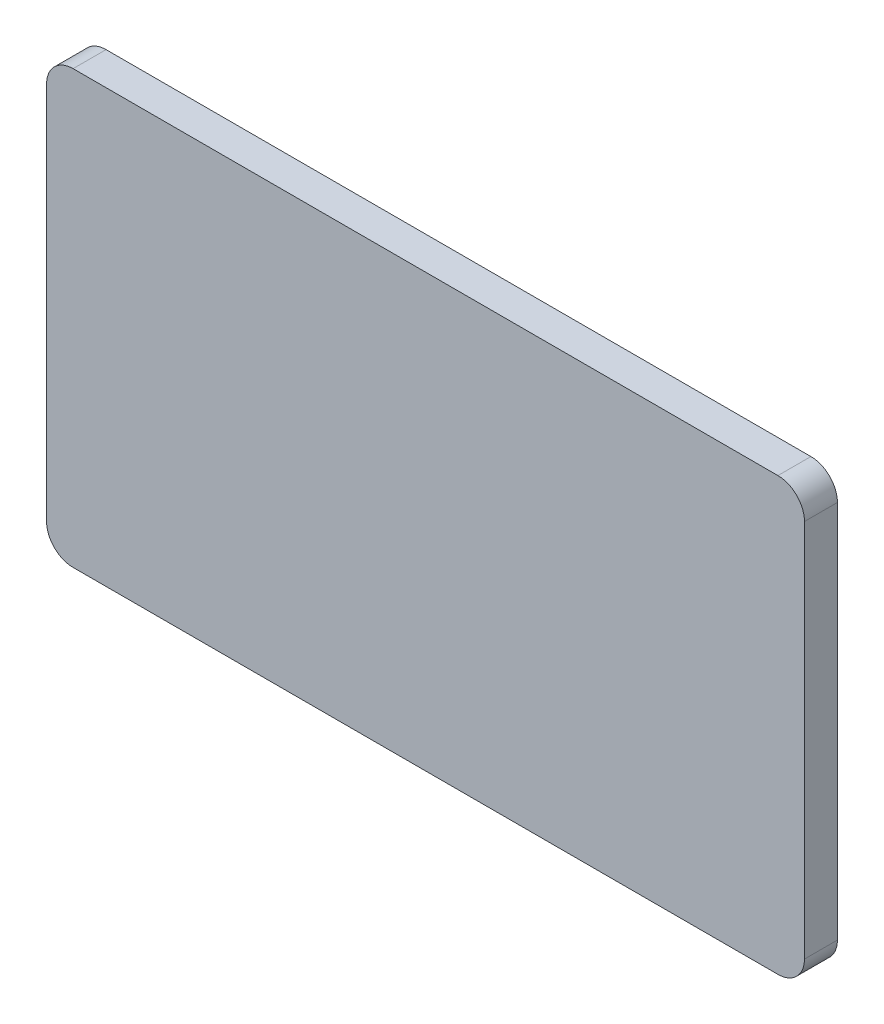
ISO-10303-21;
HEADER;
FILE_DESCRIPTION(('STEP AP214'),'2;1');
FILE_NAME('part.step','',(''),(''),'','','');
FILE_SCHEMA(('AUTOMOTIVE_DESIGN { 1 0 10303 214 1 1 1 1 }'));
ENDSEC;
DATA;
#1=APPLICATION_CONTEXT('core data for automotive mechanical design processes');
#2=APPLICATION_PROTOCOL_DEFINITION('international standard','automotive_design',2000,#1);
#3=PRODUCT_CONTEXT('',#1,'mechanical');
#4=PRODUCT('Part','Part','',(#3));
#5=PRODUCT_RELATED_PRODUCT_CATEGORY('part','',(#4));
#6=PRODUCT_DEFINITION_FORMATION('','',#4);
#7=PRODUCT_DEFINITION_CONTEXT('part definition',#1,'design');
#8=PRODUCT_DEFINITION('design','',#6,#7);
#9=PRODUCT_DEFINITION_SHAPE('','',#8);
#10=(LENGTH_UNIT() NAMED_UNIT(*) SI_UNIT(.MILLI.,.METRE.));
#11=(NAMED_UNIT(*) PLANE_ANGLE_UNIT() SI_UNIT($,.RADIAN.));
#12=(NAMED_UNIT(*) SI_UNIT($,.STERADIAN.) SOLID_ANGLE_UNIT());
#13=UNCERTAINTY_MEASURE_WITH_UNIT(LENGTH_MEASURE(1.E-05),#10,'distance_accuracy_value','');
#14=(GEOMETRIC_REPRESENTATION_CONTEXT(3) GLOBAL_UNCERTAINTY_ASSIGNED_CONTEXT((#13)) GLOBAL_UNIT_ASSIGNED_CONTEXT((#10,
#11,#12)) REPRESENTATION_CONTEXT('',''));
#15=CARTESIAN_POINT('',(0.,0.,0.));
#16=DIRECTION('',(0.,0.,1.));
#17=DIRECTION('',(1.,0.,0.));
#18=AXIS2_PLACEMENT_3D('',#15,#16,#17);
#19=CARTESIAN_POINT('',(-100.,0.,8.7));
#20=DIRECTION('',(-1.,0.,0.));
#21=DIRECTION('',(0.,0.,1.));
#22=AXIS2_PLACEMENT_3D('',#19,#20,#21);
#23=PLANE('',#22);
#24=DIRECTION('',(0.,1.,0.));
#25=VECTOR('',#24,1.);
#26=CARTESIAN_POINT('',(-100.,0.,8.7));
#27=LINE('',#26,#25);
#28=CARTESIAN_POINT('',(-100.,7.,8.7));
#29=VERTEX_POINT('',#28);
#30=CARTESIAN_POINT('',(-100.,107.,8.7));
#31=VERTEX_POINT('',#30);
#32=EDGE_CURVE('E165',#29,#31,#27,.T.);
#33=ORIENTED_EDGE('',*,*,#32,.T.);
#34=DIRECTION('',(0.,0.,-1.));
#35=VECTOR('',#34,1.);
#36=CARTESIAN_POINT('',(-100.,107.,8.7));
#37=LINE('',#36,#35);
#38=CARTESIAN_POINT('',(-100.,107.,0.));
#39=VERTEX_POINT('',#38);
#40=EDGE_CURVE('E11',#31,#39,#37,.T.);
#41=ORIENTED_EDGE('',*,*,#40,.T.);
#42=DIRECTION('',(0.,1.,0.));
#43=VECTOR('',#42,1.);
#44=CARTESIAN_POINT('',(-100.,0.,0.));
#45=LINE('',#44,#43);
#46=CARTESIAN_POINT('',(-100.,7.,0.));
#47=VERTEX_POINT('',#46);
#48=EDGE_CURVE('E161',#47,#39,#45,.T.);
#49=ORIENTED_EDGE('',*,*,#48,.F.);
#50=DIRECTION('',(0.,0.,-1.));
#51=VECTOR('',#50,1.);
#52=CARTESIAN_POINT('',(-100.,7.,8.7));
#53=LINE('',#52,#51);
#54=EDGE_CURVE('E40',#47,#29,#53,.F.);
#55=ORIENTED_EDGE('',*,*,#54,.T.);
#56=EDGE_LOOP('',(#33,#41,#49,#55));
#57=FACE_BOUND('',#56,.T.);
#58=ADVANCED_FACE('F32',(#57),#23,.T.);
#59=CARTESIAN_POINT('',(-100.,0.,8.7));
#60=DIRECTION('',(0.,1.,0.));
#61=DIRECTION('',(0.,0.,1.));
#62=AXIS2_PLACEMENT_3D('',#59,#60,#61);
#63=PLANE('',#62);
#64=DIRECTION('',(1.,0.,0.));
#65=VECTOR('',#64,1.);
#66=CARTESIAN_POINT('',(-100.,0.,0.));
#67=LINE('',#66,#65);
#68=CARTESIAN_POINT('',(-93.,0.,0.));
#69=VERTEX_POINT('',#68);
#70=CARTESIAN_POINT('',(93.,0.,0.));
#71=VERTEX_POINT('',#70);
#72=EDGE_CURVE('E169',#69,#71,#67,.T.);
#73=ORIENTED_EDGE('',*,*,#72,.T.);
#74=DIRECTION('',(0.,0.,-1.));
#75=VECTOR('',#74,1.);
#76=CARTESIAN_POINT('',(93.,0.,8.7));
#77=LINE('',#76,#75);
#78=CARTESIAN_POINT('',(93.,0.,8.7));
#79=VERTEX_POINT('',#78);
#80=EDGE_CURVE('E47',#71,#79,#77,.F.);
#81=ORIENTED_EDGE('',*,*,#80,.T.);
#82=DIRECTION('',(1.,0.,0.));
#83=VECTOR('',#82,1.);
#84=CARTESIAN_POINT('',(-100.,0.,8.7));
#85=LINE('',#84,#83);
#86=CARTESIAN_POINT('',(-93.,0.,8.7));
#87=VERTEX_POINT('',#86);
#88=EDGE_CURVE('E175',#87,#79,#85,.T.);
#89=ORIENTED_EDGE('',*,*,#88,.F.);
#90=DIRECTION('',(0.,0.,-1.));
#91=VECTOR('',#90,1.);
#92=CARTESIAN_POINT('',(-93.,0.,0.));
#93=LINE('',#92,#91);
#94=EDGE_CURVE('E211',#87,#69,#93,.T.);
#95=ORIENTED_EDGE('',*,*,#94,.T.);
#96=EDGE_LOOP('',(#73,#81,#89,#95));
#97=FACE_BOUND('',#96,.T.);
#98=ADVANCED_FACE('F224',(#97),#63,.F.);
#99=CARTESIAN_POINT('',(100.,0.,8.7));
#100=DIRECTION('',(-1.,0.,0.));
#101=DIRECTION('',(0.,0.,1.));
#102=AXIS2_PLACEMENT_3D('',#99,#100,#101);
#103=PLANE('',#102);
#104=DIRECTION('',(0.,1.,0.));
#105=VECTOR('',#104,1.);
#106=CARTESIAN_POINT('',(100.,0.,0.));
#107=LINE('',#106,#105);
#108=CARTESIAN_POINT('',(100.,7.,0.));
#109=VERTEX_POINT('',#108);
#110=CARTESIAN_POINT('',(100.,107.,0.));
#111=VERTEX_POINT('',#110);
#112=EDGE_CURVE('E183',#109,#111,#107,.T.);
#113=ORIENTED_EDGE('',*,*,#112,.T.);
#114=DIRECTION('',(0.,0.,-1.));
#115=VECTOR('',#114,1.);
#116=CARTESIAN_POINT('',(100.,107.,8.7));
#117=LINE('',#116,#115);
#118=CARTESIAN_POINT('',(100.,107.,8.7));
#119=VERTEX_POINT('',#118);
#120=EDGE_CURVE('E202',#111,#119,#117,.F.);
#121=ORIENTED_EDGE('',*,*,#120,.T.);
#122=DIRECTION('',(0.,1.,0.));
#123=VECTOR('',#122,1.);
#124=CARTESIAN_POINT('',(100.,0.,8.7));
#125=LINE('',#124,#123);
#126=CARTESIAN_POINT('',(100.,7.,8.7));
#127=VERTEX_POINT('',#126);
#128=EDGE_CURVE('E172',#127,#119,#125,.T.);
#129=ORIENTED_EDGE('',*,*,#128,.F.);
#130=DIRECTION('',(0.,0.,-1.));
#131=VECTOR('',#130,1.);
#132=CARTESIAN_POINT('',(100.,7.,8.7));
#133=LINE('',#132,#131);
#134=EDGE_CURVE('E199',#127,#109,#133,.T.);
#135=ORIENTED_EDGE('',*,*,#134,.T.);
#136=EDGE_LOOP('',(#113,#121,#129,#135));
#137=FACE_BOUND('',#136,.T.);
#138=ADVANCED_FACE('F234',(#137),#103,.F.);
#139=CARTESIAN_POINT('',(-100.,114.,8.7));
#140=DIRECTION('',(0.,1.,0.));
#141=DIRECTION('',(0.,0.,1.));
#142=AXIS2_PLACEMENT_3D('',#139,#140,#141);
#143=PLANE('',#142);
#144=DIRECTION('',(1.,0.,0.));
#145=VECTOR('',#144,1.);
#146=CARTESIAN_POINT('',(-100.,114.,8.7));
#147=LINE('',#146,#145);
#148=CARTESIAN_POINT('',(-93.,114.,8.7));
#149=VERTEX_POINT('',#148);
#150=CARTESIAN_POINT('',(93.,114.,8.7));
#151=VERTEX_POINT('',#150);
#152=EDGE_CURVE('E168',#149,#151,#147,.T.);
#153=ORIENTED_EDGE('',*,*,#152,.T.);
#154=DIRECTION('',(0.,0.,-1.));
#155=VECTOR('',#154,1.);
#156=CARTESIAN_POINT('',(93.,114.,0.));
#157=LINE('',#156,#155);
#158=CARTESIAN_POINT('',(93.,114.,0.));
#159=VERTEX_POINT('',#158);
#160=EDGE_CURVE('E188',#151,#159,#157,.T.);
#161=ORIENTED_EDGE('',*,*,#160,.T.);
#162=DIRECTION('',(1.,0.,0.));
#163=VECTOR('',#162,1.);
#164=CARTESIAN_POINT('',(-100.,114.,0.));
#165=LINE('',#164,#163);
#166=CARTESIAN_POINT('',(-93.,114.,0.));
#167=VERTEX_POINT('',#166);
#168=EDGE_CURVE('E180',#167,#159,#165,.T.);
#169=ORIENTED_EDGE('',*,*,#168,.F.);
#170=DIRECTION('',(0.,0.,-1.));
#171=VECTOR('',#170,1.);
#172=CARTESIAN_POINT('',(-93.,114.,8.7));
#173=LINE('',#172,#171);
#174=EDGE_CURVE('E177',#167,#149,#173,.F.);
#175=ORIENTED_EDGE('',*,*,#174,.T.);
#176=EDGE_LOOP('',(#153,#161,#169,#175));
#177=FACE_BOUND('',#176,.T.);
#178=ADVANCED_FACE('F242',(#177),#143,.T.);
#179=CARTESIAN_POINT('',(0.,0.,8.7));
#180=DIRECTION('',(0.,0.,-1.));
#181=DIRECTION('',(-1.,0.,0.));
#182=AXIS2_PLACEMENT_3D('',#179,#180,#181);
#183=PLANE('',#182);
#184=ORIENTED_EDGE('',*,*,#128,.T.);
#185=CARTESIAN_POINT('',(93.,107.,8.7));
#186=DIRECTION('',(0.,0.,-1.));
#187=DIRECTION('',(-1.,0.,0.));
#188=AXIS2_PLACEMENT_3D('',#185,#186,#187);
#189=CIRCLE('',#188,7.);
#190=EDGE_CURVE('E209',#119,#151,#189,.F.);
#191=ORIENTED_EDGE('',*,*,#190,.T.);
#192=ORIENTED_EDGE('',*,*,#152,.F.);
#193=CARTESIAN_POINT('',(-93.,107.,8.7));
#194=DIRECTION('',(0.,0.,-1.));
#195=DIRECTION('',(-1.,0.,0.));
#196=AXIS2_PLACEMENT_3D('',#193,#194,#195);
#197=CIRCLE('',#196,7.);
#198=EDGE_CURVE('E205',#149,#31,#197,.F.);
#199=ORIENTED_EDGE('',*,*,#198,.T.);
#200=ORIENTED_EDGE('',*,*,#32,.F.);
#201=CARTESIAN_POINT('',(-93.,7.,8.7));
#202=DIRECTION('',(0.,0.,-1.));
#203=DIRECTION('',(-1.,0.,0.));
#204=AXIS2_PLACEMENT_3D('',#201,#202,#203);
#205=CIRCLE('',#204,7.);
#206=EDGE_CURVE('E54',#29,#87,#205,.F.);
#207=ORIENTED_EDGE('',*,*,#206,.T.);
#208=ORIENTED_EDGE('',*,*,#88,.T.);
#209=CARTESIAN_POINT('',(93.,7.,8.7));
#210=DIRECTION('',(0.,0.,-1.));
#211=DIRECTION('',(-1.,0.,0.));
#212=AXIS2_PLACEMENT_3D('',#209,#210,#211);
#213=CIRCLE('',#212,7.);
#214=EDGE_CURVE('E207',#79,#127,#213,.F.);
#215=ORIENTED_EDGE('',*,*,#214,.T.);
#216=EDGE_LOOP('',(#184,#191,#192,#199,#200,#207,#208,#215));
#217=FACE_BOUND('',#216,.T.);
#218=ADVANCED_FACE('F219',(#217),#183,.F.);
#219=CARTESIAN_POINT('',(0.,0.,0.));
#220=DIRECTION('',(0.,0.,-1.));
#221=DIRECTION('',(-1.,0.,0.));
#222=AXIS2_PLACEMENT_3D('',#219,#220,#221);
#223=PLANE('',#222);
#224=DIRECTION('',(1.,0.,0.));
#225=VECTOR('',#224,1.);
#226=CARTESIAN_POINT('',(-75.5,104.,0.));
#227=LINE('',#226,#225);
#228=CARTESIAN_POINT('',(-75.5,104.,0.));
#229=VERTEX_POINT('',#228);
#230=CARTESIAN_POINT('',(75.5,104.,0.));
#231=VERTEX_POINT('',#230);
#232=EDGE_CURVE('E129',#229,#231,#227,.T.);
#233=ORIENTED_EDGE('',*,*,#232,.F.);
#234=DIRECTION('',(0.,-1.,0.));
#235=VECTOR('',#234,1.);
#236=CARTESIAN_POINT('',(-75.5,104.,0.));
#237=LINE('',#236,#235);
#238=CARTESIAN_POINT('',(-75.5,10.,0.));
#239=VERTEX_POINT('',#238);
#240=EDGE_CURVE('E146',#229,#239,#237,.T.);
#241=ORIENTED_EDGE('',*,*,#240,.T.);
#242=DIRECTION('',(1.,0.,0.));
#243=VECTOR('',#242,1.);
#244=CARTESIAN_POINT('',(-75.5,10.,0.));
#245=LINE('',#244,#243);
#246=CARTESIAN_POINT('',(75.5,9.99999999999997,0.));
#247=VERTEX_POINT('',#246);
#248=EDGE_CURVE('E149',#239,#247,#245,.T.);
#249=ORIENTED_EDGE('',*,*,#248,.T.);
#250=DIRECTION('',(0.,-1.,0.));
#251=VECTOR('',#250,1.);
#252=CARTESIAN_POINT('',(75.5,104.,0.));
#253=LINE('',#252,#251);
#254=EDGE_CURVE('E155',#231,#247,#253,.T.);
#255=ORIENTED_EDGE('',*,*,#254,.F.);
#256=EDGE_LOOP('',(#233,#241,#249,#255));
#257=FACE_BOUND('',#256,.T.);
#258=ORIENTED_EDGE('',*,*,#168,.T.);
#259=CARTESIAN_POINT('',(93.,107.,0.));
#260=DIRECTION('',(0.,0.,-1.));
#261=DIRECTION('',(-1.,0.,0.));
#262=AXIS2_PLACEMENT_3D('',#259,#260,#261);
#263=CIRCLE('',#262,7.);
#264=EDGE_CURVE('E197',#159,#111,#263,.T.);
#265=ORIENTED_EDGE('',*,*,#264,.T.);
#266=ORIENTED_EDGE('',*,*,#112,.F.);
#267=CARTESIAN_POINT('',(93.,7.,0.));
#268=DIRECTION('',(0.,0.,-1.));
#269=DIRECTION('',(-1.,0.,0.));
#270=AXIS2_PLACEMENT_3D('',#267,#268,#269);
#271=CIRCLE('',#270,7.);
#272=EDGE_CURVE('E195',#109,#71,#271,.T.);
#273=ORIENTED_EDGE('',*,*,#272,.T.);
#274=ORIENTED_EDGE('',*,*,#72,.F.);
#275=CARTESIAN_POINT('',(-93.,7.,0.));
#276=DIRECTION('',(0.,0.,-1.));
#277=DIRECTION('',(-1.,0.,0.));
#278=AXIS2_PLACEMENT_3D('',#275,#276,#277);
#279=CIRCLE('',#278,7.);
#280=EDGE_CURVE('E191',#69,#47,#279,.T.);
#281=ORIENTED_EDGE('',*,*,#280,.T.);
#282=ORIENTED_EDGE('',*,*,#48,.T.);
#283=CARTESIAN_POINT('',(-93.,107.,0.));
#284=DIRECTION('',(0.,0.,-1.));
#285=DIRECTION('',(-1.,0.,0.));
#286=AXIS2_PLACEMENT_3D('',#283,#284,#285);
#287=CIRCLE('',#286,7.);
#288=EDGE_CURVE('E193',#39,#167,#287,.T.);
#289=ORIENTED_EDGE('',*,*,#288,.T.);
#290=EDGE_LOOP('',(#258,#265,#266,#273,#274,#281,#282,#289));
#291=FACE_BOUND('',#290,.T.);
#292=ADVANCED_FACE('F226',(#257,#291),#223,.T.);
#293=CARTESIAN_POINT('',(-75.5,104.,2.));
#294=DIRECTION('',(0.,1.,0.));
#295=DIRECTION('',(-1.,0.,0.));
#296=AXIS2_PLACEMENT_3D('',#293,#294,#295);
#297=PLANE('',#296);
#298=ORIENTED_EDGE('',*,*,#232,.T.);
#299=DIRECTION('',(0.,0.,-1.));
#300=VECTOR('',#299,1.);
#301=CARTESIAN_POINT('',(75.5,104.,2.));
#302=LINE('',#301,#300);
#303=CARTESIAN_POINT('',(75.5,104.,2.));
#304=VERTEX_POINT('',#303);
#305=EDGE_CURVE('E123',#304,#231,#302,.T.);
#306=ORIENTED_EDGE('',*,*,#305,.F.);
#307=DIRECTION('',(1.,0.,0.));
#308=VECTOR('',#307,1.);
#309=CARTESIAN_POINT('',(-75.5,104.,2.));
#310=LINE('',#309,#308);
#311=CARTESIAN_POINT('',(-75.5,104.,2.));
#312=VERTEX_POINT('',#311);
#313=EDGE_CURVE('E127',#312,#304,#310,.T.);
#314=ORIENTED_EDGE('',*,*,#313,.F.);
#315=DIRECTION('',(0.,0.,-1.));
#316=VECTOR('',#315,1.);
#317=CARTESIAN_POINT('',(-75.5,104.,2.));
#318=LINE('',#317,#316);
#319=EDGE_CURVE('E159',#312,#229,#318,.T.);
#320=ORIENTED_EDGE('',*,*,#319,.T.);
#321=EDGE_LOOP('',(#298,#306,#314,#320));
#322=FACE_BOUND('',#321,.T.);
#323=ADVANCED_FACE('F125',(#322),#297,.F.);
#324=CARTESIAN_POINT('',(-75.5,104.,2.));
#325=DIRECTION('',(1.,0.,0.));
#326=DIRECTION('',(0.,0.,-1.));
#327=AXIS2_PLACEMENT_3D('',#324,#325,#326);
#328=PLANE('',#327);
#329=ORIENTED_EDGE('',*,*,#240,.F.);
#330=ORIENTED_EDGE('',*,*,#319,.F.);
#331=DIRECTION('',(0.,-1.,0.));
#332=VECTOR('',#331,1.);
#333=CARTESIAN_POINT('',(-75.5,104.,2.));
#334=LINE('',#333,#332);
#335=CARTESIAN_POINT('',(-75.5,10.,2.));
#336=VERTEX_POINT('',#335);
#337=EDGE_CURVE('E134',#312,#336,#334,.T.);
#338=ORIENTED_EDGE('',*,*,#337,.T.);
#339=DIRECTION('',(0.,0.,-1.));
#340=VECTOR('',#339,1.);
#341=CARTESIAN_POINT('',(-75.5,10.,2.));
#342=LINE('',#341,#340);
#343=EDGE_CURVE('E162',#336,#239,#342,.T.);
#344=ORIENTED_EDGE('',*,*,#343,.T.);
#345=EDGE_LOOP('',(#329,#330,#338,#344));
#346=FACE_BOUND('',#345,.T.);
#347=ADVANCED_FACE('F272',(#346),#328,.T.);
#348=CARTESIAN_POINT('',(-75.5,10.,2.));
#349=DIRECTION('',(0.,1.,0.));
#350=DIRECTION('',(-1.,0.,0.));
#351=AXIS2_PLACEMENT_3D('',#348,#349,#350);
#352=PLANE('',#351);
#353=ORIENTED_EDGE('',*,*,#248,.F.);
#354=ORIENTED_EDGE('',*,*,#343,.F.);
#355=DIRECTION('',(1.,0.,0.));
#356=VECTOR('',#355,1.);
#357=CARTESIAN_POINT('',(-75.5,10.,2.));
#358=LINE('',#357,#356);
#359=CARTESIAN_POINT('',(75.5,9.99999999999997,2.));
#360=VERTEX_POINT('',#359);
#361=EDGE_CURVE('E142',#336,#360,#358,.T.);
#362=ORIENTED_EDGE('',*,*,#361,.T.);
#363=DIRECTION('',(0.,0.,-1.));
#364=VECTOR('',#363,1.);
#365=CARTESIAN_POINT('',(75.5,9.99999999999997,2.));
#366=LINE('',#365,#364);
#367=EDGE_CURVE('E133',#360,#247,#366,.T.);
#368=ORIENTED_EDGE('',*,*,#367,.T.);
#369=EDGE_LOOP('',(#353,#354,#362,#368));
#370=FACE_BOUND('',#369,.T.);
#371=ADVANCED_FACE('F269',(#370),#352,.T.);
#372=CARTESIAN_POINT('',(75.5,104.,2.));
#373=DIRECTION('',(1.,0.,0.));
#374=DIRECTION('',(0.,0.,-1.));
#375=AXIS2_PLACEMENT_3D('',#372,#373,#374);
#376=PLANE('',#375);
#377=ORIENTED_EDGE('',*,*,#254,.T.);
#378=ORIENTED_EDGE('',*,*,#367,.F.);
#379=DIRECTION('',(0.,-1.,0.));
#380=VECTOR('',#379,1.);
#381=CARTESIAN_POINT('',(75.5,104.,2.));
#382=LINE('',#381,#380);
#383=EDGE_CURVE('E138',#304,#360,#382,.T.);
#384=ORIENTED_EDGE('',*,*,#383,.F.);
#385=ORIENTED_EDGE('',*,*,#305,.T.);
#386=EDGE_LOOP('',(#377,#378,#384,#385));
#387=FACE_BOUND('',#386,.T.);
#388=ADVANCED_FACE('F139',(#387),#376,.F.);
#389=CARTESIAN_POINT('',(0.,0.,2.));
#390=DIRECTION('',(0.,0.,-1.));
#391=DIRECTION('',(-1.,0.,0.));
#392=AXIS2_PLACEMENT_3D('',#389,#390,#391);
#393=PLANE('',#392);
#394=ORIENTED_EDGE('',*,*,#313,.T.);
#395=ORIENTED_EDGE('',*,*,#383,.T.);
#396=ORIENTED_EDGE('',*,*,#361,.F.);
#397=ORIENTED_EDGE('',*,*,#337,.F.);
#398=EDGE_LOOP('',(#394,#395,#396,#397));
#399=FACE_BOUND('',#398,.T.);
#400=ADVANCED_FACE('F145',(#399),#393,.T.);
#401=CARTESIAN_POINT('',(93.,107.,8.7));
#402=DIRECTION('',(0.,0.,1.));
#403=DIRECTION('',(1.,0.,0.));
#404=AXIS2_PLACEMENT_3D('',#401,#402,#403);
#405=CYLINDRICAL_SURFACE('',#404,7.);
#406=ORIENTED_EDGE('',*,*,#190,.F.);
#407=ORIENTED_EDGE('',*,*,#120,.F.);
#408=ORIENTED_EDGE('',*,*,#264,.F.);
#409=ORIENTED_EDGE('',*,*,#160,.F.);
#410=EDGE_LOOP('',(#406,#407,#408,#409));
#411=FACE_BOUND('',#410,.T.);
#412=ADVANCED_FACE('F239',(#411),#405,.T.);
#413=CARTESIAN_POINT('',(93.,7.,8.7));
#414=DIRECTION('',(0.,0.,-1.));
#415=DIRECTION('',(-1.,0.,0.));
#416=AXIS2_PLACEMENT_3D('',#413,#414,#415);
#417=CYLINDRICAL_SURFACE('',#416,7.);
#418=ORIENTED_EDGE('',*,*,#214,.F.);
#419=ORIENTED_EDGE('',*,*,#80,.F.);
#420=ORIENTED_EDGE('',*,*,#272,.F.);
#421=ORIENTED_EDGE('',*,*,#134,.F.);
#422=EDGE_LOOP('',(#418,#419,#420,#421));
#423=FACE_BOUND('',#422,.T.);
#424=ADVANCED_FACE('F231',(#423),#417,.T.);
#425=CARTESIAN_POINT('',(-93.,107.,8.7));
#426=DIRECTION('',(0.,0.,-1.));
#427=DIRECTION('',(-1.,0.,0.));
#428=AXIS2_PLACEMENT_3D('',#425,#426,#427);
#429=CYLINDRICAL_SURFACE('',#428,7.);
#430=ORIENTED_EDGE('',*,*,#198,.F.);
#431=ORIENTED_EDGE('',*,*,#174,.F.);
#432=ORIENTED_EDGE('',*,*,#288,.F.);
#433=ORIENTED_EDGE('',*,*,#40,.F.);
#434=EDGE_LOOP('',(#430,#431,#432,#433));
#435=FACE_BOUND('',#434,.T.);
#436=ADVANCED_FACE('F245',(#435),#429,.T.);
#437=CARTESIAN_POINT('',(-93.,7.,8.7));
#438=DIRECTION('',(0.,0.,1.));
#439=DIRECTION('',(1.,0.,0.));
#440=AXIS2_PLACEMENT_3D('',#437,#438,#439);
#441=CYLINDRICAL_SURFACE('',#440,7.);
#442=ORIENTED_EDGE('',*,*,#206,.F.);
#443=ORIENTED_EDGE('',*,*,#54,.F.);
#444=ORIENTED_EDGE('',*,*,#280,.F.);
#445=ORIENTED_EDGE('',*,*,#94,.F.);
#446=EDGE_LOOP('',(#442,#443,#444,#445));
#447=FACE_BOUND('',#446,.T.);
#448=ADVANCED_FACE('F34',(#447),#441,.T.);
#449=CLOSED_SHELL('',(#58,#98,#138,#178,#218,#292,#323,#347,#371,#388,#400,#412,#424,#436,#448));
#450=MANIFOLD_SOLID_BREP('B2',#449);
#451=ADVANCED_BREP_SHAPE_REPRESENTATION('',(#18,#450),#14);
#452=SHAPE_DEFINITION_REPRESENTATION(#9,#451);
ENDSEC;
END-ISO-10303-21;
